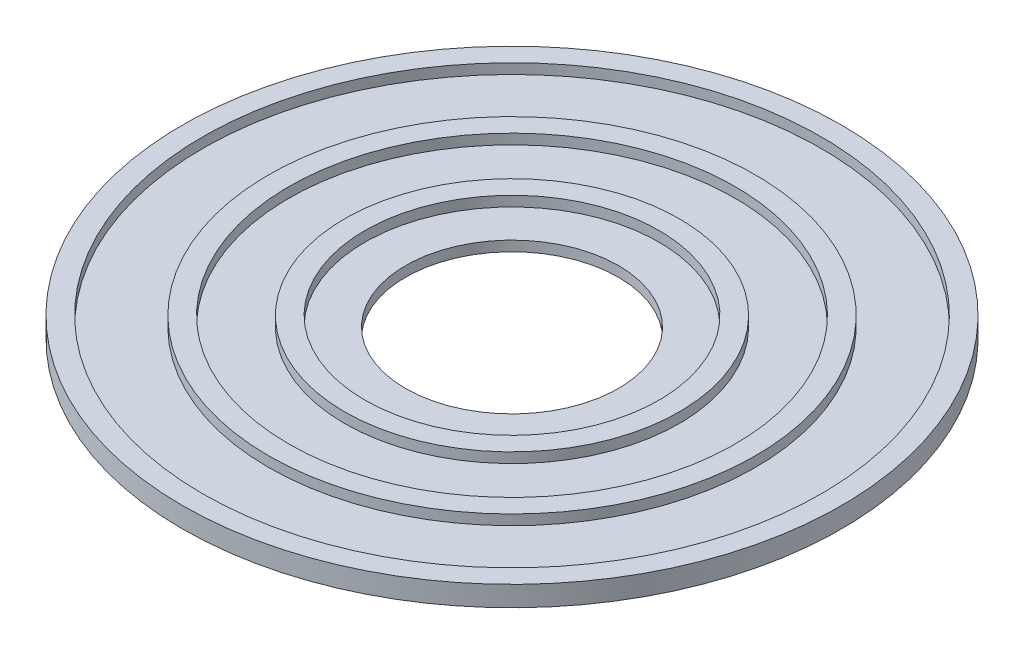
ISO-10303-21;
HEADER;
FILE_DESCRIPTION(('STEP AP214'),'2;1');
FILE_NAME('part.step','',(''),(''),'','','');
FILE_SCHEMA(('AUTOMOTIVE_DESIGN { 1 0 10303 214 1 1 1 1 }'));
ENDSEC;
DATA;
#1=APPLICATION_CONTEXT('core data for automotive mechanical design processes');
#2=APPLICATION_PROTOCOL_DEFINITION('international standard','automotive_design',2000,#1);
#3=PRODUCT_CONTEXT('',#1,'mechanical');
#4=PRODUCT('Part','Part','',(#3));
#5=PRODUCT_RELATED_PRODUCT_CATEGORY('part','',(#4));
#6=PRODUCT_DEFINITION_FORMATION('','',#4);
#7=PRODUCT_DEFINITION_CONTEXT('part definition',#1,'design');
#8=PRODUCT_DEFINITION('design','',#6,#7);
#9=PRODUCT_DEFINITION_SHAPE('','',#8);
#10=(LENGTH_UNIT() NAMED_UNIT(*) SI_UNIT(.MILLI.,.METRE.));
#11=(NAMED_UNIT(*) PLANE_ANGLE_UNIT() SI_UNIT($,.RADIAN.));
#12=(NAMED_UNIT(*) SI_UNIT($,.STERADIAN.) SOLID_ANGLE_UNIT());
#13=UNCERTAINTY_MEASURE_WITH_UNIT(LENGTH_MEASURE(1.E-05),#10,'distance_accuracy_value','');
#14=(GEOMETRIC_REPRESENTATION_CONTEXT(3) GLOBAL_UNCERTAINTY_ASSIGNED_CONTEXT((#13)) GLOBAL_UNIT_ASSIGNED_CONTEXT((#10,
#11,#12)) REPRESENTATION_CONTEXT('',''));
#15=CARTESIAN_POINT('',(0.,0.,0.));
#16=DIRECTION('',(0.,0.,1.));
#17=DIRECTION('',(1.,0.,0.));
#18=AXIS2_PLACEMENT_3D('',#15,#16,#17);
#19=CARTESIAN_POINT('',(0.,1.,0.));
#20=DIRECTION('',(0.,1.,0.));
#21=DIRECTION('',(0.,0.,1.));
#22=AXIS2_PLACEMENT_3D('',#19,#20,#21);
#23=PLANE('',#22);
#24=CARTESIAN_POINT('',(0.,1.,0.));
#25=DIRECTION('',(0.,1.,0.));
#26=DIRECTION('',(0.,0.,1.));
#27=AXIS2_PLACEMENT_3D('',#24,#25,#26);
#28=CIRCLE('',#27,10.5);
#29=CARTESIAN_POINT('',(0.,1.,10.5));
#30=VERTEX_POINT('',#29);
#31=EDGE_CURVE('E70',#30,#30,#28,.T.);
#32=ORIENTED_EDGE('',*,*,#31,.F.);
#33=EDGE_LOOP('',(#32));
#34=FACE_BOUND('',#33,.T.);
#35=CARTESIAN_POINT('',(0.,1.,0.));
#36=DIRECTION('',(0.,1.,0.));
#37=DIRECTION('',(0.,0.,1.));
#38=AXIS2_PLACEMENT_3D('',#35,#36,#37);
#39=CIRCLE('',#38,14.5);
#40=CARTESIAN_POINT('',(0.,1.,14.5));
#41=VERTEX_POINT('',#40);
#42=EDGE_CURVE('E11',#41,#41,#39,.F.);
#43=ORIENTED_EDGE('',*,*,#42,.F.);
#44=EDGE_LOOP('',(#43));
#45=FACE_BOUND('',#44,.T.);
#46=ADVANCED_FACE('F50',(#34,#45),#23,.T.);
#47=CARTESIAN_POINT('',(0.,1.,0.));
#48=DIRECTION('',(0.,1.,0.));
#49=DIRECTION('',(0.,0.,1.));
#50=AXIS2_PLACEMENT_3D('',#47,#48,#49);
#51=CIRCLE('',#50,16.5);
#52=CARTESIAN_POINT('',(0.,1.,16.5));
#53=VERTEX_POINT('',#52);
#54=EDGE_CURVE('E92',#53,#53,#51,.T.);
#55=ORIENTED_EDGE('',*,*,#54,.F.);
#56=EDGE_LOOP('',(#55));
#57=FACE_BOUND('',#56,.T.);
#58=CARTESIAN_POINT('',(0.,1.,0.));
#59=DIRECTION('',(0.,1.,0.));
#60=DIRECTION('',(0.,0.,1.));
#61=AXIS2_PLACEMENT_3D('',#58,#59,#60);
#62=CIRCLE('',#61,22.);
#63=CARTESIAN_POINT('',(0.,1.,22.));
#64=VERTEX_POINT('',#63);
#65=EDGE_CURVE('E57',#64,#64,#62,.F.);
#66=ORIENTED_EDGE('',*,*,#65,.F.);
#67=EDGE_LOOP('',(#66));
#68=FACE_BOUND('',#67,.T.);
#69=ADVANCED_FACE('F115',(#57,#68),#23,.T.);
#70=CARTESIAN_POINT('',(0.,1.,0.));
#71=DIRECTION('',(0.,1.,0.));
#72=DIRECTION('',(0.,0.,1.));
#73=AXIS2_PLACEMENT_3D('',#70,#71,#72);
#74=CIRCLE('',#73,24.);
#75=CARTESIAN_POINT('',(0.,1.,24.));
#76=VERTEX_POINT('',#75);
#77=EDGE_CURVE('E83',#76,#76,#74,.T.);
#78=ORIENTED_EDGE('',*,*,#77,.F.);
#79=EDGE_LOOP('',(#78));
#80=FACE_BOUND('',#79,.T.);
#81=CARTESIAN_POINT('',(0.,1.,0.));
#82=DIRECTION('',(0.,1.,0.));
#83=DIRECTION('',(0.,0.,1.));
#84=AXIS2_PLACEMENT_3D('',#81,#82,#83);
#85=CIRCLE('',#84,30.5);
#86=CARTESIAN_POINT('',(0.,1.,30.5));
#87=VERTEX_POINT('',#86);
#88=EDGE_CURVE('E61',#87,#87,#85,.F.);
#89=ORIENTED_EDGE('',*,*,#88,.F.);
#90=EDGE_LOOP('',(#89));
#91=FACE_BOUND('',#90,.T.);
#92=ADVANCED_FACE('F118',(#80,#91),#23,.T.);
#93=CARTESIAN_POINT('',(0.,0.,0.));
#94=DIRECTION('',(0.,1.,0.));
#95=DIRECTION('',(0.,0.,1.));
#96=AXIS2_PLACEMENT_3D('',#93,#94,#95);
#97=PLANE('',#96);
#98=CARTESIAN_POINT('',(0.,0.,0.));
#99=DIRECTION('',(0.,1.,0.));
#100=DIRECTION('',(0.,0.,1.));
#101=AXIS2_PLACEMENT_3D('',#98,#99,#100);
#102=CIRCLE('',#101,32.5);
#103=CARTESIAN_POINT('',(0.,0.,32.5));
#104=VERTEX_POINT('',#103);
#105=EDGE_CURVE('E65',#104,#104,#102,.T.);
#106=ORIENTED_EDGE('',*,*,#105,.F.);
#107=EDGE_LOOP('',(#106));
#108=FACE_BOUND('',#107,.T.);
#109=CARTESIAN_POINT('',(0.,0.,0.));
#110=DIRECTION('',(0.,1.,0.));
#111=DIRECTION('',(0.,0.,1.));
#112=AXIS2_PLACEMENT_3D('',#109,#110,#111);
#113=CIRCLE('',#112,10.5);
#114=CARTESIAN_POINT('',(0.,0.,10.5));
#115=VERTEX_POINT('',#114);
#116=EDGE_CURVE('E71',#115,#115,#113,.T.);
#117=ORIENTED_EDGE('',*,*,#116,.T.);
#118=EDGE_LOOP('',(#117));
#119=FACE_BOUND('',#118,.T.);
#120=ADVANCED_FACE('F124',(#108,#119),#97,.F.);
#121=CARTESIAN_POINT('',(0.,1.,0.));
#122=DIRECTION('',(0.,-1.,0.));
#123=DIRECTION('',(0.,0.,-1.));
#124=AXIS2_PLACEMENT_3D('',#121,#122,#123);
#125=CYLINDRICAL_SURFACE('',#124,32.5);
#126=ORIENTED_EDGE('',*,*,#105,.T.);
#127=EDGE_LOOP('',(#126));
#128=FACE_BOUND('',#127,.T.);
#129=CARTESIAN_POINT('',(0.,2.,0.));
#130=DIRECTION('',(0.,1.,0.));
#131=DIRECTION('',(0.,0.,1.));
#132=AXIS2_PLACEMENT_3D('',#129,#130,#131);
#133=CIRCLE('',#132,32.5);
#134=CARTESIAN_POINT('',(0.,2.,32.5));
#135=VERTEX_POINT('',#134);
#136=EDGE_CURVE('E74',#135,#135,#133,.T.);
#137=ORIENTED_EDGE('',*,*,#136,.F.);
#138=EDGE_LOOP('',(#137));
#139=FACE_BOUND('',#138,.T.);
#140=ADVANCED_FACE('F52',(#128,#139),#125,.T.);
#141=CARTESIAN_POINT('',(0.,1.,0.));
#142=DIRECTION('',(0.,-1.,0.));
#143=DIRECTION('',(0.,0.,-1.));
#144=AXIS2_PLACEMENT_3D('',#141,#142,#143);
#145=CYLINDRICAL_SURFACE('',#144,10.5);
#146=ORIENTED_EDGE('',*,*,#31,.T.);
#147=EDGE_LOOP('',(#146));
#148=FACE_BOUND('',#147,.T.);
#149=ORIENTED_EDGE('',*,*,#116,.F.);
#150=EDGE_LOOP('',(#149));
#151=FACE_BOUND('',#150,.T.);
#152=ADVANCED_FACE('F128',(#148,#151),#145,.F.);
#153=CARTESIAN_POINT('',(0.,2.,0.));
#154=DIRECTION('',(0.,-1.,0.));
#155=DIRECTION('',(0.,0.,-1.));
#156=AXIS2_PLACEMENT_3D('',#153,#154,#155);
#157=CYLINDRICAL_SURFACE('',#156,30.5);
#158=CARTESIAN_POINT('',(0.,2.,0.));
#159=DIRECTION('',(0.,1.,0.));
#160=DIRECTION('',(0.,0.,1.));
#161=AXIS2_PLACEMENT_3D('',#158,#159,#160);
#162=CIRCLE('',#161,30.5);
#163=CARTESIAN_POINT('',(0.,2.,30.5));
#164=VERTEX_POINT('',#163);
#165=EDGE_CURVE('E79',#164,#164,#162,.T.);
#166=ORIENTED_EDGE('',*,*,#165,.T.);
#167=EDGE_LOOP('',(#166));
#168=FACE_BOUND('',#167,.T.);
#169=ORIENTED_EDGE('',*,*,#88,.T.);
#170=EDGE_LOOP('',(#169));
#171=FACE_BOUND('',#170,.T.);
#172=ADVANCED_FACE('F141',(#168,#171),#157,.F.);
#173=CARTESIAN_POINT('',(0.,2.,0.));
#174=DIRECTION('',(0.,1.,0.));
#175=DIRECTION('',(0.,0.,1.));
#176=AXIS2_PLACEMENT_3D('',#173,#174,#175);
#177=PLANE('',#176);
#178=ORIENTED_EDGE('',*,*,#165,.F.);
#179=EDGE_LOOP('',(#178));
#180=FACE_BOUND('',#179,.T.);
#181=ORIENTED_EDGE('',*,*,#136,.T.);
#182=EDGE_LOOP('',(#181));
#183=FACE_BOUND('',#182,.T.);
#184=ADVANCED_FACE('F146',(#180,#183),#177,.T.);
#185=CARTESIAN_POINT('',(0.,2.,0.));
#186=DIRECTION('',(0.,-1.,0.));
#187=DIRECTION('',(0.,0.,-1.));
#188=AXIS2_PLACEMENT_3D('',#185,#186,#187);
#189=CYLINDRICAL_SURFACE('',#188,22.);
#190=CARTESIAN_POINT('',(0.,2.,0.));
#191=DIRECTION('',(0.,1.,0.));
#192=DIRECTION('',(0.,0.,1.));
#193=AXIS2_PLACEMENT_3D('',#190,#191,#192);
#194=CIRCLE('',#193,22.);
#195=CARTESIAN_POINT('',(0.,2.,22.));
#196=VERTEX_POINT('',#195);
#197=EDGE_CURVE('E86',#196,#196,#194,.T.);
#198=ORIENTED_EDGE('',*,*,#197,.T.);
#199=EDGE_LOOP('',(#198));
#200=FACE_BOUND('',#199,.T.);
#201=ORIENTED_EDGE('',*,*,#65,.T.);
#202=EDGE_LOOP('',(#201));
#203=FACE_BOUND('',#202,.T.);
#204=ADVANCED_FACE('F153',(#200,#203),#189,.F.);
#205=CARTESIAN_POINT('',(0.,2.,0.));
#206=DIRECTION('',(0.,-1.,0.));
#207=DIRECTION('',(0.,0.,-1.));
#208=AXIS2_PLACEMENT_3D('',#205,#206,#207);
#209=CYLINDRICAL_SURFACE('',#208,24.);
#210=CARTESIAN_POINT('',(0.,2.,0.));
#211=DIRECTION('',(0.,1.,0.));
#212=DIRECTION('',(0.,0.,1.));
#213=AXIS2_PLACEMENT_3D('',#210,#211,#212);
#214=CIRCLE('',#213,24.);
#215=CARTESIAN_POINT('',(0.,2.,24.));
#216=VERTEX_POINT('',#215);
#217=EDGE_CURVE('E82',#216,#216,#214,.T.);
#218=ORIENTED_EDGE('',*,*,#217,.F.);
#219=EDGE_LOOP('',(#218));
#220=FACE_BOUND('',#219,.T.);
#221=ORIENTED_EDGE('',*,*,#77,.T.);
#222=EDGE_LOOP('',(#221));
#223=FACE_BOUND('',#222,.T.);
#224=ADVANCED_FACE('F160',(#220,#223),#209,.T.);
#225=CARTESIAN_POINT('',(0.,2.,0.));
#226=DIRECTION('',(0.,1.,0.));
#227=DIRECTION('',(0.,0.,1.));
#228=AXIS2_PLACEMENT_3D('',#225,#226,#227);
#229=PLANE('',#228);
#230=ORIENTED_EDGE('',*,*,#197,.F.);
#231=EDGE_LOOP('',(#230));
#232=FACE_BOUND('',#231,.T.);
#233=ORIENTED_EDGE('',*,*,#217,.T.);
#234=EDGE_LOOP('',(#233));
#235=FACE_BOUND('',#234,.T.);
#236=ADVANCED_FACE('F164',(#232,#235),#229,.T.);
#237=CARTESIAN_POINT('',(0.,2.,0.));
#238=DIRECTION('',(0.,-1.,0.));
#239=DIRECTION('',(0.,0.,-1.));
#240=AXIS2_PLACEMENT_3D('',#237,#238,#239);
#241=CYLINDRICAL_SURFACE('',#240,14.5);
#242=CARTESIAN_POINT('',(0.,2.,0.));
#243=DIRECTION('',(0.,1.,0.));
#244=DIRECTION('',(0.,0.,1.));
#245=AXIS2_PLACEMENT_3D('',#242,#243,#244);
#246=CIRCLE('',#245,14.5);
#247=CARTESIAN_POINT('',(0.,2.,14.5));
#248=VERTEX_POINT('',#247);
#249=EDGE_CURVE('E95',#248,#248,#246,.T.);
#250=ORIENTED_EDGE('',*,*,#249,.T.);
#251=EDGE_LOOP('',(#250));
#252=FACE_BOUND('',#251,.T.);
#253=ORIENTED_EDGE('',*,*,#42,.T.);
#254=EDGE_LOOP('',(#253));
#255=FACE_BOUND('',#254,.T.);
#256=ADVANCED_FACE('F101',(#252,#255),#241,.F.);
#257=CARTESIAN_POINT('',(0.,2.,0.));
#258=DIRECTION('',(0.,-1.,0.));
#259=DIRECTION('',(0.,0.,-1.));
#260=AXIS2_PLACEMENT_3D('',#257,#258,#259);
#261=CYLINDRICAL_SURFACE('',#260,16.5);
#262=CARTESIAN_POINT('',(0.,2.,0.));
#263=DIRECTION('',(0.,1.,0.));
#264=DIRECTION('',(0.,0.,1.));
#265=AXIS2_PLACEMENT_3D('',#262,#263,#264);
#266=CIRCLE('',#265,16.5);
#267=CARTESIAN_POINT('',(0.,2.,16.5));
#268=VERTEX_POINT('',#267);
#269=EDGE_CURVE('E87',#268,#268,#266,.T.);
#270=ORIENTED_EDGE('',*,*,#269,.F.);
#271=EDGE_LOOP('',(#270));
#272=FACE_BOUND('',#271,.T.);
#273=ORIENTED_EDGE('',*,*,#54,.T.);
#274=EDGE_LOOP('',(#273));
#275=FACE_BOUND('',#274,.T.);
#276=ADVANCED_FACE('F106',(#272,#275),#261,.T.);
#277=CARTESIAN_POINT('',(0.,2.,0.));
#278=DIRECTION('',(0.,1.,0.));
#279=DIRECTION('',(0.,0.,1.));
#280=AXIS2_PLACEMENT_3D('',#277,#278,#279);
#281=PLANE('',#280);
#282=ORIENTED_EDGE('',*,*,#249,.F.);
#283=EDGE_LOOP('',(#282));
#284=FACE_BOUND('',#283,.T.);
#285=ORIENTED_EDGE('',*,*,#269,.T.);
#286=EDGE_LOOP('',(#285));
#287=FACE_BOUND('',#286,.T.);
#288=ADVANCED_FACE('F103',(#284,#287),#281,.T.);
#289=CLOSED_SHELL('',(#46,#69,#92,#120,#140,#152,#172,#184,#204,#224,#236,#256,#276,#288));
#290=MANIFOLD_SOLID_BREP('B2',#289);
#291=ADVANCED_BREP_SHAPE_REPRESENTATION('',(#18,#290),#14);
#292=SHAPE_DEFINITION_REPRESENTATION(#9,#291);
ENDSEC;
END-ISO-10303-21;
